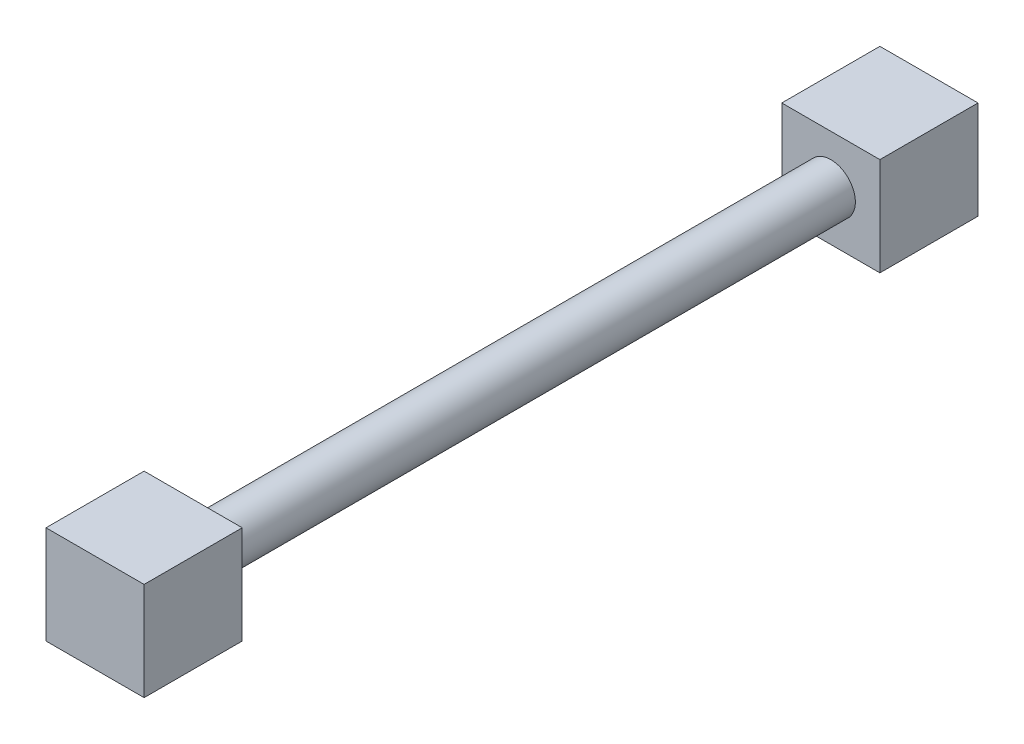
ISO-10303-21;
HEADER;
FILE_DESCRIPTION(('STEP AP214'),'2;1');
FILE_NAME('part.step','',(''),(''),'','','');
FILE_SCHEMA(('AUTOMOTIVE_DESIGN { 1 0 10303 214 1 1 1 1 }'));
ENDSEC;
DATA;
#1=APPLICATION_CONTEXT('core data for automotive mechanical design processes');
#2=APPLICATION_PROTOCOL_DEFINITION('international standard','automotive_design',2000,#1);
#3=PRODUCT_CONTEXT('',#1,'mechanical');
#4=PRODUCT('Part','Part','',(#3));
#5=PRODUCT_RELATED_PRODUCT_CATEGORY('part','',(#4));
#6=PRODUCT_DEFINITION_FORMATION('','',#4);
#7=PRODUCT_DEFINITION_CONTEXT('part definition',#1,'design');
#8=PRODUCT_DEFINITION('design','',#6,#7);
#9=PRODUCT_DEFINITION_SHAPE('','',#8);
#10=(LENGTH_UNIT() NAMED_UNIT(*) SI_UNIT(.MILLI.,.METRE.));
#11=(NAMED_UNIT(*) PLANE_ANGLE_UNIT() SI_UNIT($,.RADIAN.));
#12=(NAMED_UNIT(*) SI_UNIT($,.STERADIAN.) SOLID_ANGLE_UNIT());
#13=UNCERTAINTY_MEASURE_WITH_UNIT(LENGTH_MEASURE(1.E-05),#10,'distance_accuracy_value','');
#14=(GEOMETRIC_REPRESENTATION_CONTEXT(3) GLOBAL_UNCERTAINTY_ASSIGNED_CONTEXT((#13)) GLOBAL_UNIT_ASSIGNED_CONTEXT((#10,
#11,#12)) REPRESENTATION_CONTEXT('',''));
#15=CARTESIAN_POINT('',(0.,0.,0.));
#16=DIRECTION('',(0.,0.,1.));
#17=DIRECTION('',(1.,0.,0.));
#18=AXIS2_PLACEMENT_3D('',#15,#16,#17);
#19=CARTESIAN_POINT('',(-25.4,-25.4,-25.4));
#20=DIRECTION('',(1.,0.,0.));
#21=DIRECTION('',(0.,0.,-1.));
#22=AXIS2_PLACEMENT_3D('',#19,#20,#21);
#23=PLANE('',#22);
#24=DIRECTION('',(0.,1.,0.));
#25=VECTOR('',#24,1.);
#26=CARTESIAN_POINT('',(-25.4,-25.4,25.4));
#27=LINE('',#26,#25);
#28=CARTESIAN_POINT('',(-25.4,-25.4,25.4));
#29=VERTEX_POINT('',#28);
#30=CARTESIAN_POINT('',(-25.4,25.4,25.4));
#31=VERTEX_POINT('',#30);
#32=EDGE_CURVE('E141',#29,#31,#27,.T.);
#33=ORIENTED_EDGE('',*,*,#32,.T.);
#34=DIRECTION('',(0.,0.,1.));
#35=VECTOR('',#34,1.);
#36=CARTESIAN_POINT('',(-25.4,25.4,-25.4));
#37=LINE('',#36,#35);
#38=CARTESIAN_POINT('',(-25.4,25.4,-25.4));
#39=VERTEX_POINT('',#38);
#40=EDGE_CURVE('E47',#39,#31,#37,.T.);
#41=ORIENTED_EDGE('',*,*,#40,.F.);
#42=DIRECTION('',(0.,1.,0.));
#43=VECTOR('',#42,1.);
#44=CARTESIAN_POINT('',(-25.4,-25.4,-25.4));
#45=LINE('',#44,#43);
#46=CARTESIAN_POINT('',(-25.4,-25.4,-25.4));
#47=VERTEX_POINT('',#46);
#48=EDGE_CURVE('E146',#47,#39,#45,.T.);
#49=ORIENTED_EDGE('',*,*,#48,.F.);
#50=DIRECTION('',(0.,0.,1.));
#51=VECTOR('',#50,1.);
#52=CARTESIAN_POINT('',(-25.4,-25.4,-25.4));
#53=LINE('',#52,#51);
#54=EDGE_CURVE('E152',#47,#29,#53,.T.);
#55=ORIENTED_EDGE('',*,*,#54,.T.);
#56=EDGE_LOOP('',(#33,#41,#49,#55));
#57=FACE_BOUND('',#56,.T.);
#58=ADVANCED_FACE('F37',(#57),#23,.F.);
#59=CARTESIAN_POINT('',(25.4,25.4,-25.4));
#60=DIRECTION('',(0.,-1.,0.));
#61=DIRECTION('',(0.,0.,-1.));
#62=AXIS2_PLACEMENT_3D('',#59,#60,#61);
#63=PLANE('',#62);
#64=DIRECTION('',(1.,0.,0.));
#65=VECTOR('',#64,1.);
#66=CARTESIAN_POINT('',(25.4,25.4,25.4));
#67=LINE('',#66,#65);
#68=CARTESIAN_POINT('',(25.4,25.4,25.4));
#69=VERTEX_POINT('',#68);
#70=EDGE_CURVE('E155',#31,#69,#67,.T.);
#71=ORIENTED_EDGE('',*,*,#70,.T.);
#72=DIRECTION('',(0.,0.,1.));
#73=VECTOR('',#72,1.);
#74=CARTESIAN_POINT('',(25.4,25.4,-25.4));
#75=LINE('',#74,#73);
#76=CARTESIAN_POINT('',(25.4,25.4,-25.4));
#77=VERTEX_POINT('',#76);
#78=EDGE_CURVE('E162',#77,#69,#75,.T.);
#79=ORIENTED_EDGE('',*,*,#78,.F.);
#80=DIRECTION('',(1.,0.,0.));
#81=VECTOR('',#80,1.);
#82=CARTESIAN_POINT('',(25.4,25.4,-25.4));
#83=LINE('',#82,#81);
#84=EDGE_CURVE('E87',#39,#77,#83,.T.);
#85=ORIENTED_EDGE('',*,*,#84,.F.);
#86=ORIENTED_EDGE('',*,*,#40,.T.);
#87=EDGE_LOOP('',(#71,#79,#85,#86));
#88=FACE_BOUND('',#87,.T.);
#89=ADVANCED_FACE('F165',(#88),#63,.F.);
#90=CARTESIAN_POINT('',(25.4,-25.4,-25.4));
#91=DIRECTION('',(-1.,0.,0.));
#92=DIRECTION('',(0.,0.,1.));
#93=AXIS2_PLACEMENT_3D('',#90,#91,#92);
#94=PLANE('',#93);
#95=DIRECTION('',(0.,-1.,0.));
#96=VECTOR('',#95,1.);
#97=CARTESIAN_POINT('',(25.4,-25.4,25.4));
#98=LINE('',#97,#96);
#99=CARTESIAN_POINT('',(25.4,-25.4,25.4));
#100=VERTEX_POINT('',#99);
#101=EDGE_CURVE('E73',#69,#100,#98,.T.);
#102=ORIENTED_EDGE('',*,*,#101,.T.);
#103=DIRECTION('',(0.,0.,1.));
#104=VECTOR('',#103,1.);
#105=CARTESIAN_POINT('',(25.4,-25.4,-25.4));
#106=LINE('',#105,#104);
#107=CARTESIAN_POINT('',(25.4,-25.4,-25.4));
#108=VERTEX_POINT('',#107);
#109=EDGE_CURVE('E160',#108,#100,#106,.T.);
#110=ORIENTED_EDGE('',*,*,#109,.F.);
#111=DIRECTION('',(0.,-1.,0.));
#112=VECTOR('',#111,1.);
#113=CARTESIAN_POINT('',(25.4,-25.4,-25.4));
#114=LINE('',#113,#112);
#115=EDGE_CURVE('E149',#77,#108,#114,.T.);
#116=ORIENTED_EDGE('',*,*,#115,.F.);
#117=ORIENTED_EDGE('',*,*,#78,.T.);
#118=EDGE_LOOP('',(#102,#110,#116,#117));
#119=FACE_BOUND('',#118,.T.);
#120=ADVANCED_FACE('F188',(#119),#94,.F.);
#121=CARTESIAN_POINT('',(25.4,-25.4,-25.4));
#122=DIRECTION('',(0.,1.,0.));
#123=DIRECTION('',(0.,0.,1.));
#124=AXIS2_PLACEMENT_3D('',#121,#122,#123);
#125=PLANE('',#124);
#126=DIRECTION('',(-1.,0.,0.));
#127=VECTOR('',#126,1.);
#128=CARTESIAN_POINT('',(25.4,-25.4,25.4));
#129=LINE('',#128,#127);
#130=EDGE_CURVE('E79',#100,#29,#129,.T.);
#131=ORIENTED_EDGE('',*,*,#130,.T.);
#132=ORIENTED_EDGE('',*,*,#54,.F.);
#133=DIRECTION('',(-1.,0.,0.));
#134=VECTOR('',#133,1.);
#135=CARTESIAN_POINT('',(25.4,-25.4,-25.4));
#136=LINE('',#135,#134);
#137=EDGE_CURVE('E55',#108,#47,#136,.T.);
#138=ORIENTED_EDGE('',*,*,#137,.F.);
#139=ORIENTED_EDGE('',*,*,#109,.T.);
#140=EDGE_LOOP('',(#131,#132,#138,#139));
#141=FACE_BOUND('',#140,.T.);
#142=ADVANCED_FACE('F180',(#141),#125,.F.);
#143=CARTESIAN_POINT('',(0.,0.,-25.4));
#144=DIRECTION('',(0.,0.,1.));
#145=DIRECTION('',(1.,0.,0.));
#146=AXIS2_PLACEMENT_3D('',#143,#144,#145);
#147=PLANE('',#146);
#148=ORIENTED_EDGE('',*,*,#48,.T.);
#149=ORIENTED_EDGE('',*,*,#84,.T.);
#150=ORIENTED_EDGE('',*,*,#115,.T.);
#151=ORIENTED_EDGE('',*,*,#137,.T.);
#152=EDGE_LOOP('',(#148,#149,#150,#151));
#153=FACE_BOUND('',#152,.T.);
#154=ADVANCED_FACE('F172',(#153),#147,.F.);
#155=CARTESIAN_POINT('',(0.,0.,25.4));
#156=DIRECTION('',(0.,0.,1.));
#157=DIRECTION('',(1.,0.,0.));
#158=AXIS2_PLACEMENT_3D('',#155,#156,#157);
#159=PLANE('',#158);
#160=CARTESIAN_POINT('',(0.,0.,25.4));
#161=DIRECTION('',(0.,0.,1.));
#162=DIRECTION('',(1.,0.,0.));
#163=AXIS2_PLACEMENT_3D('',#160,#161,#162);
#164=CIRCLE('',#163,12.7);
#165=CARTESIAN_POINT('',(12.7,0.,25.4));
#166=VERTEX_POINT('',#165);
#167=EDGE_CURVE('E11',#166,#166,#164,.T.);
#168=ORIENTED_EDGE('',*,*,#167,.F.);
#169=EDGE_LOOP('',(#168));
#170=FACE_BOUND('',#169,.T.);
#171=ORIENTED_EDGE('',*,*,#32,.F.);
#172=ORIENTED_EDGE('',*,*,#130,.F.);
#173=ORIENTED_EDGE('',*,*,#101,.F.);
#174=ORIENTED_EDGE('',*,*,#70,.F.);
#175=EDGE_LOOP('',(#171,#172,#173,#174));
#176=FACE_BOUND('',#175,.T.);
#177=ADVANCED_FACE('F170',(#170,#176),#159,.T.);
#178=CARTESIAN_POINT('',(0.,0.,381.));
#179=DIRECTION('',(0.,0.,-1.));
#180=DIRECTION('',(-1.,0.,0.));
#181=AXIS2_PLACEMENT_3D('',#178,#179,#180);
#182=CYLINDRICAL_SURFACE('',#181,12.7);
#183=CARTESIAN_POINT('',(0.,0.,355.6));
#184=DIRECTION('',(0.,0.,-1.));
#185=DIRECTION('',(-1.,0.,0.));
#186=AXIS2_PLACEMENT_3D('',#183,#184,#185);
#187=CIRCLE('',#186,12.7);
#188=CARTESIAN_POINT('',(-12.7,0.,355.6));
#189=VERTEX_POINT('',#188);
#190=EDGE_CURVE('E41',#189,#189,#187,.T.);
#191=ORIENTED_EDGE('',*,*,#190,.T.);
#192=EDGE_LOOP('',(#191));
#193=FACE_BOUND('',#192,.T.);
#194=ORIENTED_EDGE('',*,*,#167,.T.);
#195=EDGE_LOOP('',(#194));
#196=FACE_BOUND('',#195,.T.);
#197=ADVANCED_FACE('F39',(#193,#196),#182,.T.);
#198=CARTESIAN_POINT('',(25.4,-25.4,406.4));
#199=DIRECTION('',(-1.,0.,0.));
#200=DIRECTION('',(0.,0.,1.));
#201=AXIS2_PLACEMENT_3D('',#198,#199,#200);
#202=PLANE('',#201);
#203=DIRECTION('',(0.,1.,0.));
#204=VECTOR('',#203,1.);
#205=CARTESIAN_POINT('',(25.4,-25.4,355.6));
#206=LINE('',#205,#204);
#207=CARTESIAN_POINT('',(25.4,-25.4,355.6));
#208=VERTEX_POINT('',#207);
#209=CARTESIAN_POINT('',(25.4,25.4,355.6));
#210=VERTEX_POINT('',#209);
#211=EDGE_CURVE('E138',#208,#210,#206,.T.);
#212=ORIENTED_EDGE('',*,*,#211,.T.);
#213=DIRECTION('',(0.,0.,-1.));
#214=VECTOR('',#213,1.);
#215=CARTESIAN_POINT('',(25.4,25.4,406.4));
#216=LINE('',#215,#214);
#217=CARTESIAN_POINT('',(25.4,25.4,406.4));
#218=VERTEX_POINT('',#217);
#219=EDGE_CURVE('E118',#218,#210,#216,.T.);
#220=ORIENTED_EDGE('',*,*,#219,.F.);
#221=DIRECTION('',(0.,1.,0.));
#222=VECTOR('',#221,1.);
#223=CARTESIAN_POINT('',(25.4,-25.4,406.4));
#224=LINE('',#223,#222);
#225=CARTESIAN_POINT('',(25.4,-25.4,406.4));
#226=VERTEX_POINT('',#225);
#227=EDGE_CURVE('E125',#226,#218,#224,.T.);
#228=ORIENTED_EDGE('',*,*,#227,.F.);
#229=DIRECTION('',(0.,0.,-1.));
#230=VECTOR('',#229,1.);
#231=CARTESIAN_POINT('',(25.4,-25.4,406.4));
#232=LINE('',#231,#230);
#233=EDGE_CURVE('E324',#226,#208,#232,.T.);
#234=ORIENTED_EDGE('',*,*,#233,.T.);
#235=EDGE_LOOP('',(#212,#220,#228,#234));
#236=FACE_BOUND('',#235,.T.);
#237=ADVANCED_FACE('F136',(#236),#202,.F.);
#238=CARTESIAN_POINT('',(-25.4,25.4,406.4));
#239=DIRECTION('',(0.,-1.,0.));
#240=DIRECTION('',(0.,0.,-1.));
#241=AXIS2_PLACEMENT_3D('',#238,#239,#240);
#242=PLANE('',#241);
#243=DIRECTION('',(-1.,0.,0.));
#244=VECTOR('',#243,1.);
#245=CARTESIAN_POINT('',(-25.4,25.4,355.6));
#246=LINE('',#245,#244);
#247=CARTESIAN_POINT('',(-25.4,25.4,355.6));
#248=VERTEX_POINT('',#247);
#249=EDGE_CURVE('E315',#210,#248,#246,.T.);
#250=ORIENTED_EDGE('',*,*,#249,.T.);
#251=DIRECTION('',(0.,0.,-1.));
#252=VECTOR('',#251,1.);
#253=CARTESIAN_POINT('',(-25.4,25.4,406.4));
#254=LINE('',#253,#252);
#255=CARTESIAN_POINT('',(-25.4,25.4,406.4));
#256=VERTEX_POINT('',#255);
#257=EDGE_CURVE('E121',#256,#248,#254,.T.);
#258=ORIENTED_EDGE('',*,*,#257,.F.);
#259=DIRECTION('',(-1.,0.,0.));
#260=VECTOR('',#259,1.);
#261=CARTESIAN_POINT('',(-25.4,25.4,406.4));
#262=LINE('',#261,#260);
#263=EDGE_CURVE('E114',#218,#256,#262,.T.);
#264=ORIENTED_EDGE('',*,*,#263,.F.);
#265=ORIENTED_EDGE('',*,*,#219,.T.);
#266=EDGE_LOOP('',(#250,#258,#264,#265));
#267=FACE_BOUND('',#266,.T.);
#268=ADVANCED_FACE('F116',(#267),#242,.F.);
#269=CARTESIAN_POINT('',(-25.4,-25.4,406.4));
#270=DIRECTION('',(1.,0.,0.));
#271=DIRECTION('',(0.,0.,-1.));
#272=AXIS2_PLACEMENT_3D('',#269,#270,#271);
#273=PLANE('',#272);
#274=DIRECTION('',(0.,-1.,0.));
#275=VECTOR('',#274,1.);
#276=CARTESIAN_POINT('',(-25.4,-25.4,355.6));
#277=LINE('',#276,#275);
#278=CARTESIAN_POINT('',(-25.4,-25.4,355.6));
#279=VERTEX_POINT('',#278);
#280=EDGE_CURVE('E317',#248,#279,#277,.T.);
#281=ORIENTED_EDGE('',*,*,#280,.T.);
#282=DIRECTION('',(0.,0.,-1.));
#283=VECTOR('',#282,1.);
#284=CARTESIAN_POINT('',(-25.4,-25.4,406.4));
#285=LINE('',#284,#283);
#286=CARTESIAN_POINT('',(-25.4,-25.4,406.4));
#287=VERTEX_POINT('',#286);
#288=EDGE_CURVE('E142',#287,#279,#285,.T.);
#289=ORIENTED_EDGE('',*,*,#288,.F.);
#290=DIRECTION('',(0.,-1.,0.));
#291=VECTOR('',#290,1.);
#292=CARTESIAN_POINT('',(-25.4,-25.4,406.4));
#293=LINE('',#292,#291);
#294=EDGE_CURVE('E124',#256,#287,#293,.T.);
#295=ORIENTED_EDGE('',*,*,#294,.F.);
#296=ORIENTED_EDGE('',*,*,#257,.T.);
#297=EDGE_LOOP('',(#281,#289,#295,#296));
#298=FACE_BOUND('',#297,.T.);
#299=ADVANCED_FACE('F233',(#298),#273,.F.);
#300=CARTESIAN_POINT('',(-25.4,-25.4,406.4));
#301=DIRECTION('',(0.,1.,0.));
#302=DIRECTION('',(0.,0.,1.));
#303=AXIS2_PLACEMENT_3D('',#300,#301,#302);
#304=PLANE('',#303);
#305=DIRECTION('',(1.,0.,0.));
#306=VECTOR('',#305,1.);
#307=CARTESIAN_POINT('',(-25.4,-25.4,355.6));
#308=LINE('',#307,#306);
#309=EDGE_CURVE('E134',#279,#208,#308,.T.);
#310=ORIENTED_EDGE('',*,*,#309,.T.);
#311=ORIENTED_EDGE('',*,*,#233,.F.);
#312=DIRECTION('',(1.,0.,0.));
#313=VECTOR('',#312,1.);
#314=CARTESIAN_POINT('',(-25.4,-25.4,406.4));
#315=LINE('',#314,#313);
#316=EDGE_CURVE('E130',#287,#226,#315,.T.);
#317=ORIENTED_EDGE('',*,*,#316,.F.);
#318=ORIENTED_EDGE('',*,*,#288,.T.);
#319=EDGE_LOOP('',(#310,#311,#317,#318));
#320=FACE_BOUND('',#319,.T.);
#321=ADVANCED_FACE('F243',(#320),#304,.F.);
#322=CARTESIAN_POINT('',(0.,0.,406.4));
#323=DIRECTION('',(0.,0.,-1.));
#324=DIRECTION('',(-1.,0.,0.));
#325=AXIS2_PLACEMENT_3D('',#322,#323,#324);
#326=PLANE('',#325);
#327=ORIENTED_EDGE('',*,*,#227,.T.);
#328=ORIENTED_EDGE('',*,*,#263,.T.);
#329=ORIENTED_EDGE('',*,*,#294,.T.);
#330=ORIENTED_EDGE('',*,*,#316,.T.);
#331=EDGE_LOOP('',(#327,#328,#329,#330));
#332=FACE_BOUND('',#331,.T.);
#333=ADVANCED_FACE('F128',(#332),#326,.F.);
#334=CARTESIAN_POINT('',(0.,0.,355.6));
#335=DIRECTION('',(0.,0.,-1.));
#336=DIRECTION('',(-1.,0.,0.));
#337=AXIS2_PLACEMENT_3D('',#334,#335,#336);
#338=PLANE('',#337);
#339=ORIENTED_EDGE('',*,*,#190,.F.);
#340=EDGE_LOOP('',(#339));
#341=FACE_BOUND('',#340,.T.);
#342=ORIENTED_EDGE('',*,*,#211,.F.);
#343=ORIENTED_EDGE('',*,*,#309,.F.);
#344=ORIENTED_EDGE('',*,*,#280,.F.);
#345=ORIENTED_EDGE('',*,*,#249,.F.);
#346=EDGE_LOOP('',(#342,#343,#344,#345));
#347=FACE_BOUND('',#346,.T.);
#348=ADVANCED_FACE('F264',(#341,#347),#338,.T.);
#349=CLOSED_SHELL('',(#58,#89,#120,#142,#154,#177,#197,#237,#268,#299,#321,#333,#348));
#350=MANIFOLD_SOLID_BREP('B2',#349);
#351=ADVANCED_BREP_SHAPE_REPRESENTATION('',(#18,#350),#14);
#352=SHAPE_DEFINITION_REPRESENTATION(#9,#351);
ENDSEC;
END-ISO-10303-21;
